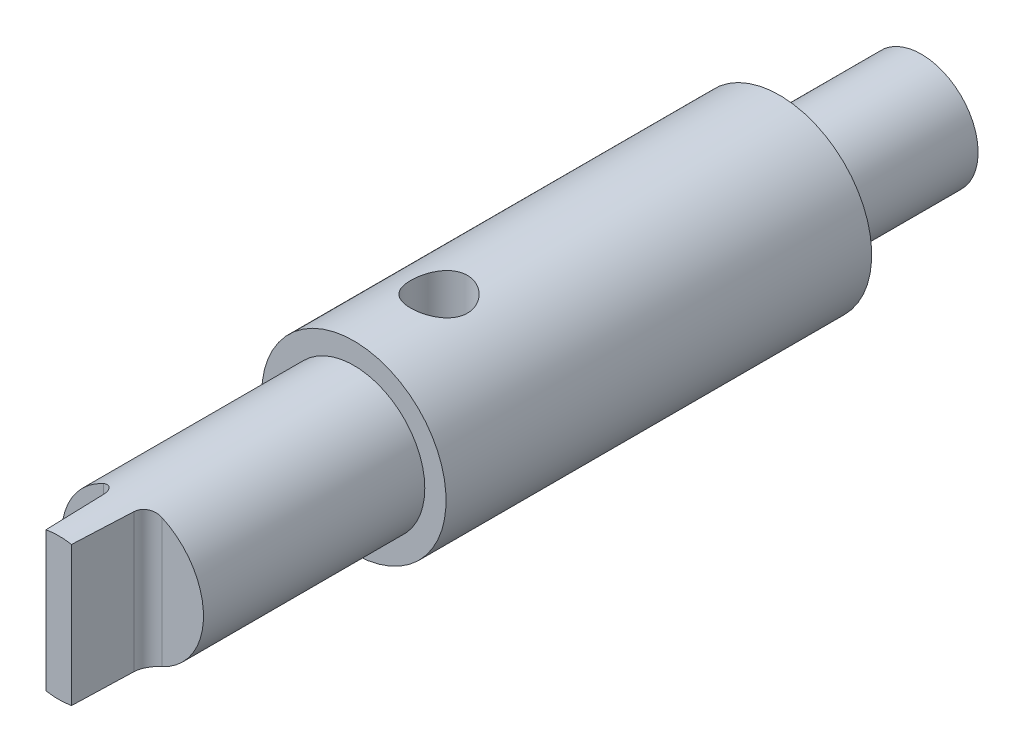
ISO-10303-21;
HEADER;
FILE_DESCRIPTION(('STEP AP214'),'2;1');
FILE_NAME('part.step','',(''),(''),'','','');
FILE_SCHEMA(('AUTOMOTIVE_DESIGN { 1 0 10303 214 1 1 1 1 }'));
ENDSEC;
DATA;
#1=APPLICATION_CONTEXT('core data for automotive mechanical design processes');
#2=APPLICATION_PROTOCOL_DEFINITION('international standard','automotive_design',2000,#1);
#3=PRODUCT_CONTEXT('',#1,'mechanical');
#4=PRODUCT('Part','Part','',(#3));
#5=PRODUCT_RELATED_PRODUCT_CATEGORY('part','',(#4));
#6=PRODUCT_DEFINITION_FORMATION('','',#4);
#7=PRODUCT_DEFINITION_CONTEXT('part definition',#1,'design');
#8=PRODUCT_DEFINITION('design','',#6,#7);
#9=PRODUCT_DEFINITION_SHAPE('','',#8);
#10=(LENGTH_UNIT() NAMED_UNIT(*) SI_UNIT(.MILLI.,.METRE.));
#11=(NAMED_UNIT(*) PLANE_ANGLE_UNIT() SI_UNIT($,.RADIAN.));
#12=(NAMED_UNIT(*) SI_UNIT($,.STERADIAN.) SOLID_ANGLE_UNIT());
#13=UNCERTAINTY_MEASURE_WITH_UNIT(LENGTH_MEASURE(1.E-05),#10,'distance_accuracy_value','');
#14=(GEOMETRIC_REPRESENTATION_CONTEXT(3) GLOBAL_UNCERTAINTY_ASSIGNED_CONTEXT((#13)) GLOBAL_UNIT_ASSIGNED_CONTEXT((#10,
#11,#12)) REPRESENTATION_CONTEXT('',''));
#15=CARTESIAN_POINT('',(0.,0.,0.));
#16=DIRECTION('',(0.,0.,1.));
#17=DIRECTION('',(1.,0.,0.));
#18=AXIS2_PLACEMENT_3D('',#15,#16,#17);
#19=CARTESIAN_POINT('',(0.,0.,10.4));
#20=DIRECTION('',(0.,0.,-1.));
#21=DIRECTION('',(-1.,0.,0.));
#22=AXIS2_PLACEMENT_3D('',#19,#20,#21);
#23=CYLINDRICAL_SURFACE('',#22,2.5);
#24=CARTESIAN_POINT('',(0.,0.,22.1));
#25=DIRECTION('',(0.999261174631314,0.,-0.0384331221012044));
#26=DIRECTION('',(-0.0384331221012044,0.,-0.999261174631314));
#27=AXIS2_PLACEMENT_3D('',#24,#25,#26);
#28=ELLIPSE('',#27,65.0480591562884,2.5);
#29=CARTESIAN_POINT('',(-0.45,-2.45916652547159,10.4));
#30=VERTEX_POINT('',#29);
#31=CARTESIAN_POINT('',(-0.531508329271177,-2.44284647407801,8.2807834389494));
#32=VERTEX_POINT('',#31);
#33=EDGE_CURVE('E105',#30,#32,#28,.T.);
#34=ORIENTED_EDGE('',*,*,#33,.T.);
#35=CARTESIAN_POINT('',(-0.531508329271177,-2.44284647407801,8.2807834389494));
#36=CARTESIAN_POINT('',(-0.532539843165584,-2.44260926882038,8.25327220437519));
#37=CARTESIAN_POINT('',(-0.535894512817613,-2.44189130170681,8.22586203774053));
#38=CARTESIAN_POINT('',(-0.547020238870603,-2.43942979065863,8.17202915411969));
#39=CARTESIAN_POINT('',(-0.554786745288273,-2.43768730326003,8.14560544965633));
#40=CARTESIAN_POINT('',(-0.574513856189634,-2.43311141426534,8.09445915749167));
#41=CARTESIAN_POINT('',(-0.586476409106,-2.43027750580827,8.06973736646394));
#42=CARTESIAN_POINT('',(-0.614184994030151,-2.42342337207427,8.02270265908097));
#43=CARTESIAN_POINT('',(-0.629930425711825,-2.41940333500764,8.00038936132197));
#44=CARTESIAN_POINT('',(-0.664730256340502,-2.41007424679488,7.95870197334573));
#45=CARTESIAN_POINT('',(-0.683794875284227,-2.40476119365302,7.93933731793193));
#46=CARTESIAN_POINT('',(-0.724552410200631,-2.3927963019297,7.90410809790614));
#47=CARTESIAN_POINT('',(-0.746245478837553,-2.38614438557024,7.88824373674754));
#48=CARTESIAN_POINT('',(-0.791993083845285,-2.37135730303825,7.86006199419344));
#49=CARTESIAN_POINT('',(-0.816085761722725,-2.36319546640232,7.84782075439814));
#50=CARTESIAN_POINT('',(-0.86550826826321,-2.34554550328077,7.82747397216907));
#51=CARTESIAN_POINT('',(-0.890838550326685,-2.33605688831899,7.81936995805999));
#52=CARTESIAN_POINT('',(-0.935453508420285,-2.31847922129885,7.80885060287264));
#53=CARTESIAN_POINT('',(-0.954631059674712,-2.31065110483783,7.80551124040373));
#54=CARTESIAN_POINT('',(-0.992956459855976,-2.2944442070253,7.80108746415022));
#55=CARTESIAN_POINT('',(-1.01210425925181,-2.28606688570284,7.79999730327699));
#56=CARTESIAN_POINT('',(-1.03113891658685,-2.27744429892379,7.79999999999995));
#57=B_SPLINE_CURVE_WITH_KNOTS('',3,(#35,#36,#37,#38,#39,#40,#41,#42,#43,#44,#45,#46,#47,#48,#49,
#50,#51,#52,#53,#54,#55,#56),.UNSPECIFIED.,.F.,.F.,(4,2,2,2,2,2,2,2,2,2,4),(0.,
0.0824834719637597,0.164882031712949,0.247318903966105,0.329742702483984,0.41242492872574,
0.495111959577522,0.57943009095499,0.663779347635486,0.726599278197953,0.789258493466607),.UNSPECIFIED.);
#58=CARTESIAN_POINT('',(-1.03113891658683,-2.27744429892371,7.8));
#59=VERTEX_POINT('',#58);
#60=EDGE_CURVE('E192',#32,#59,#57,.T.);
#61=ORIENTED_EDGE('',*,*,#60,.T.);
#62=CARTESIAN_POINT('',(0.,0.,7.8));
#63=DIRECTION('',(0.,0.,-1.));
#64=DIRECTION('',(-1.,0.,0.));
#65=AXIS2_PLACEMENT_3D('',#62,#63,#64);
#66=CIRCLE('',#65,2.5);
#67=CARTESIAN_POINT('',(-1.03113891658683,2.27744429892371,7.8));
#68=VERTEX_POINT('',#67);
#69=EDGE_CURVE('E133',#59,#68,#66,.T.);
#70=ORIENTED_EDGE('',*,*,#69,.T.);
#71=CARTESIAN_POINT('',(-1.03113891658683,2.27744429892371,7.8));
#72=CARTESIAN_POINT('',(-1.00310852586349,2.29015995289099,7.79997451048635));
#73=CARTESIAN_POINT('',(-0.974792224266202,2.3023326194819,7.80235783656512));
#74=CARTESIAN_POINT('',(-0.918401756660368,2.32538997516038,7.81204050674508));
#75=CARTESIAN_POINT('',(-0.890328336994645,2.33627149545594,7.81935166299504));
#76=CARTESIAN_POINT('',(-0.83530343928771,2.3565096654203,7.83901706973389));
#77=CARTESIAN_POINT('',(-0.808355350055991,2.36586192633451,7.85138549018253));
#78=CARTESIAN_POINT('',(-0.756727398889239,2.38287643300169,7.88097572855262));
#79=CARTESIAN_POINT('',(-0.732044130611637,2.39054124185363,7.89819009397633));
#80=CARTESIAN_POINT('',(-0.687333716391683,2.4037645903716,7.93585757854198));
#81=CARTESIAN_POINT('',(-0.667113670057396,2.40942360872693,7.95604671191024));
#82=CARTESIAN_POINT('',(-0.630268879479854,2.41932348767586,7.99979864461768));
#83=CARTESIAN_POINT('',(-0.613645568859418,2.4235637831473,8.02336278300339));
#84=CARTESIAN_POINT('',(-0.585220098070873,2.43058098198555,8.07213677168955));
#85=CARTESIAN_POINT('',(-0.573250637971295,2.43340997514698,8.09724202410013));
#86=CARTESIAN_POINT('',(-0.55362857799055,2.43794951083323,8.14916296550121));
#87=CARTESIAN_POINT('',(-0.545970619262264,2.43966144219827,8.1759764848813));
#88=CARTESIAN_POINT('',(-0.538068699423958,2.44141107555664,8.21602097906955));
#89=CARTESIAN_POINT('',(-0.536046997419788,2.44185512624989,8.22890711252894));
#90=CARTESIAN_POINT('',(-0.53301807569344,2.44251790164472,8.25478117422703));
#91=CARTESIAN_POINT('',(-0.532009104621233,2.44273701535247,8.26776888745287));
#92=CARTESIAN_POINT('',(-0.531508329271177,2.44284647407801,8.2807834389494));
#93=B_SPLINE_CURVE_WITH_KNOTS('',3,(#71,#72,#73,#74,#75,#76,#77,#78,#79,#80,#81,#82,#83,#84,#85,
#86,#87,#88,#89,#90,#91,#92),.UNSPECIFIED.,.F.,.F.,(4,2,2,2,2,2,2,2,2,2,4),(0.,
0.0922959626537357,0.184813951871417,0.277592963439273,0.37023006397065,0.45717528684934,
0.544155101639957,0.62762949695487,0.710999910003441,0.750118521259756,0.78916936621114),.UNSPECIFIED.);
#94=CARTESIAN_POINT('',(-0.531508329271177,2.44284647407801,8.2807834389494));
#95=VERTEX_POINT('',#94);
#96=EDGE_CURVE('E57',#68,#95,#93,.T.);
#97=ORIENTED_EDGE('',*,*,#96,.T.);
#98=CARTESIAN_POINT('',(-0.45,2.45916652547159,10.4));
#99=VERTEX_POINT('',#98);
#100=EDGE_CURVE('E225',#95,#99,#28,.T.);
#101=ORIENTED_EDGE('',*,*,#100,.T.);
#102=CARTESIAN_POINT('',(0.,0.,10.4));
#103=DIRECTION('',(0.,0.,1.));
#104=DIRECTION('',(1.,0.,0.));
#105=AXIS2_PLACEMENT_3D('',#102,#103,#104);
#106=CIRCLE('',#105,2.5);
#107=CARTESIAN_POINT('',(0.45,2.45916652547159,10.4));
#108=VERTEX_POINT('',#107);
#109=EDGE_CURVE('E116',#108,#99,#106,.T.);
#110=ORIENTED_EDGE('',*,*,#109,.F.);
#111=CARTESIAN_POINT('',(0.,0.,22.1));
#112=DIRECTION('',(-0.999261174631314,0.,-0.0384331221012044));
#113=DIRECTION('',(0.0384331221012044,0.,-0.999261174631314));
#114=AXIS2_PLACEMENT_3D('',#111,#112,#113);
#115=ELLIPSE('',#114,65.0480591562884,2.5);
#116=CARTESIAN_POINT('',(0.531508329271177,2.44284647407801,8.2807834389494));
#117=VERTEX_POINT('',#116);
#118=EDGE_CURVE('E106',#108,#117,#115,.T.);
#119=ORIENTED_EDGE('',*,*,#118,.T.);
#120=CARTESIAN_POINT('',(0.531508329271177,2.44284647407801,8.2807834389494));
#121=CARTESIAN_POINT('',(0.532539843165584,2.44260926882038,8.25327220437519));
#122=CARTESIAN_POINT('',(0.535894512817613,2.44189130170681,8.22586203774053));
#123=CARTESIAN_POINT('',(0.547020238870602,2.43942979065863,8.17202915411969));
#124=CARTESIAN_POINT('',(0.554786745288273,2.43768730326003,8.14560544965633));
#125=CARTESIAN_POINT('',(0.574513856189634,2.43311141426534,8.09445915749167));
#126=CARTESIAN_POINT('',(0.586476409106,2.43027750580827,8.06973736646394));
#127=CARTESIAN_POINT('',(0.614184994030151,2.42342337207427,8.02270265908096));
#128=CARTESIAN_POINT('',(0.629930425711825,2.41940333500764,8.00038936132197));
#129=CARTESIAN_POINT('',(0.664730256340502,2.41007424679488,7.95870197334573));
#130=CARTESIAN_POINT('',(0.683794875284228,2.40476119365302,7.93933731793193));
#131=CARTESIAN_POINT('',(0.724552410200632,2.3927963019297,7.90410809790614));
#132=CARTESIAN_POINT('',(0.746245478837555,2.38614438557024,7.88824373674753));
#133=CARTESIAN_POINT('',(0.791993083845286,2.37135730303825,7.86006199419344));
#134=CARTESIAN_POINT('',(0.816085761722726,2.36319546640232,7.84782075439814));
#135=CARTESIAN_POINT('',(0.865508268263211,2.34554550328077,7.82747397216907));
#136=CARTESIAN_POINT('',(0.890838550326685,2.33605688831899,7.81936995805999));
#137=CARTESIAN_POINT('',(0.935453508420286,2.31847922129885,7.80885060287264));
#138=CARTESIAN_POINT('',(0.954631059674712,2.31065110483783,7.80551124040373));
#139=CARTESIAN_POINT('',(0.992956459855976,2.2944442070253,7.80108746415022));
#140=CARTESIAN_POINT('',(1.01210425925181,2.28606688570284,7.79999730327699));
#141=CARTESIAN_POINT('',(1.03113891658685,2.27744429892379,7.79999999999995));
#142=B_SPLINE_CURVE_WITH_KNOTS('',3,(#120,#121,#122,#123,#124,#125,#126,#127,#128,#129,#130,
#131,#132,#133,#134,#135,#136,#137,#138,#139,#140,#141),.UNSPECIFIED.,.F.,.F.,(4,2,2,2,2,2,2,2,
2,2,4),(0.,0.0824834719637597,0.164882031712949,0.247318903966107,0.329742702483984,
0.412424928725741,0.495111959577524,0.579430090954991,0.663779347635487,0.726599278197954,
0.789258493466607),.UNSPECIFIED.);
#143=CARTESIAN_POINT('',(1.03113891658683,2.27744429892371,7.8));
#144=VERTEX_POINT('',#143);
#145=EDGE_CURVE('E143',#117,#144,#142,.T.);
#146=ORIENTED_EDGE('',*,*,#145,.T.);
#147=CARTESIAN_POINT('',(0.,0.,7.8));
#148=DIRECTION('',(0.,0.,-1.));
#149=DIRECTION('',(-1.,0.,0.));
#150=AXIS2_PLACEMENT_3D('',#147,#148,#149);
#151=CIRCLE('',#150,2.5);
#152=CARTESIAN_POINT('',(1.03113891658683,-2.27744429892371,7.8));
#153=VERTEX_POINT('',#152);
#154=EDGE_CURVE('E131',#144,#153,#151,.T.);
#155=ORIENTED_EDGE('',*,*,#154,.T.);
#156=CARTESIAN_POINT('',(1.03113891658683,-2.27744429892371,7.8));
#157=CARTESIAN_POINT('',(1.00310852586349,-2.29015995289099,7.79997451048635));
#158=CARTESIAN_POINT('',(0.974792224266202,-2.3023326194819,7.80235783656512));
#159=CARTESIAN_POINT('',(0.918401756660368,-2.32538997516038,7.81204050674508));
#160=CARTESIAN_POINT('',(0.890328336994645,-2.33627149545594,7.81935166299504));
#161=CARTESIAN_POINT('',(0.83530343928771,-2.3565096654203,7.83901706973389));
#162=CARTESIAN_POINT('',(0.808355350055991,-2.36586192633451,7.85138549018253));
#163=CARTESIAN_POINT('',(0.756727398889239,-2.38287643300169,7.88097572855262));
#164=CARTESIAN_POINT('',(0.732044130611637,-2.39054124185363,7.89819009397633));
#165=CARTESIAN_POINT('',(0.687333716391683,-2.4037645903716,7.93585757854198));
#166=CARTESIAN_POINT('',(0.667113670057396,-2.40942360872693,7.95604671191024));
#167=CARTESIAN_POINT('',(0.630268879479854,-2.41932348767586,7.99979864461768));
#168=CARTESIAN_POINT('',(0.613645568859418,-2.4235637831473,8.02336278300339));
#169=CARTESIAN_POINT('',(0.585220098070873,-2.43058098198555,8.07213677168955));
#170=CARTESIAN_POINT('',(0.573250637971294,-2.43340997514698,8.09724202410013));
#171=CARTESIAN_POINT('',(0.55362857799055,-2.43794951083323,8.14916296550121));
#172=CARTESIAN_POINT('',(0.545970619262263,-2.43966144219827,8.1759764848813));
#173=CARTESIAN_POINT('',(0.538068699423957,-2.44141107555664,8.21602097906955));
#174=CARTESIAN_POINT('',(0.536046997419788,-2.44185512624989,8.22890711252894));
#175=CARTESIAN_POINT('',(0.53301807569344,-2.44251790164472,8.25478117422703));
#176=CARTESIAN_POINT('',(0.532009104621232,-2.44273701535247,8.26776888745287));
#177=CARTESIAN_POINT('',(0.531508329271177,-2.44284647407801,8.2807834389494));
#178=B_SPLINE_CURVE_WITH_KNOTS('',3,(#156,#157,#158,#159,#160,#161,#162,#163,#164,#165,#166,
#167,#168,#169,#170,#171,#172,#173,#174,#175,#176,#177),.UNSPECIFIED.,.F.,.F.,(4,2,2,2,2,2,2,2,
2,2,4),(0.,0.0922959626537352,0.184813951871416,0.277592963439273,0.37023006397065,
0.45717528684934,0.544155101639958,0.62762949695487,0.710999910003441,0.750118521259756,
0.78916936621114),.UNSPECIFIED.);
#179=CARTESIAN_POINT('',(0.531508329271177,-2.44284647407801,8.2807834389494));
#180=VERTEX_POINT('',#179);
#181=EDGE_CURVE('E101',#153,#180,#178,.T.);
#182=ORIENTED_EDGE('',*,*,#181,.T.);
#183=CARTESIAN_POINT('',(0.45,-2.45916652547159,10.4));
#184=VERTEX_POINT('',#183);
#185=EDGE_CURVE('E94',#180,#184,#115,.T.);
#186=ORIENTED_EDGE('',*,*,#185,.T.);
#187=EDGE_CURVE('E98',#30,#184,#106,.T.);
#188=ORIENTED_EDGE('',*,*,#187,.F.);
#189=EDGE_LOOP('',(#34,#61,#70,#97,#101,#110,#119,#146,#155,#182,#186,#188));
#190=FACE_BOUND('',#189,.T.);
#191=CARTESIAN_POINT('',(0.,0.,0.));
#192=DIRECTION('',(0.,0.,1.));
#193=DIRECTION('',(1.,0.,0.));
#194=AXIS2_PLACEMENT_3D('',#191,#192,#193);
#195=CIRCLE('',#194,2.5);
#196=CARTESIAN_POINT('',(2.5,0.,0.));
#197=VERTEX_POINT('',#196);
#198=EDGE_CURVE('E121',#197,#197,#195,.T.);
#199=ORIENTED_EDGE('',*,*,#198,.T.);
#200=EDGE_LOOP('',(#199));
#201=FACE_BOUND('',#200,.T.);
#202=ADVANCED_FACE('F35',(#190,#201),#23,.T.);
#203=CARTESIAN_POINT('',(0.,0.,10.4));
#204=DIRECTION('',(0.,0.,1.));
#205=DIRECTION('',(1.,0.,0.));
#206=AXIS2_PLACEMENT_3D('',#203,#204,#205);
#207=PLANE('',#206);
#208=DIRECTION('',(0.,1.,0.));
#209=VECTOR('',#208,1.);
#210=CARTESIAN_POINT('',(-0.45,0.,10.4));
#211=LINE('',#210,#209);
#212=EDGE_CURVE('E115',#30,#99,#211,.T.);
#213=ORIENTED_EDGE('',*,*,#212,.F.);
#214=ORIENTED_EDGE('',*,*,#187,.T.);
#215=DIRECTION('',(0.,-1.,0.));
#216=VECTOR('',#215,1.);
#217=CARTESIAN_POINT('',(0.45,0.,10.4));
#218=LINE('',#217,#216);
#219=EDGE_CURVE('E109',#108,#184,#218,.T.);
#220=ORIENTED_EDGE('',*,*,#219,.F.);
#221=ORIENTED_EDGE('',*,*,#109,.T.);
#222=EDGE_LOOP('',(#213,#214,#220,#221));
#223=FACE_BOUND('',#222,.T.);
#224=ADVANCED_FACE('F119',(#223),#207,.T.);
#225=CARTESIAN_POINT('',(0.,0.,-15.));
#226=DIRECTION('',(0.,0.,1.));
#227=DIRECTION('',(1.,0.,0.));
#228=AXIS2_PLACEMENT_3D('',#225,#226,#227);
#229=CYLINDRICAL_SURFACE('',#228,3.25);
#230=CARTESIAN_POINT('',(0.,-3.25,-2.));
#231=CARTESIAN_POINT('',(0.05479323577704,-3.24999964593717,-2.00000048046048));
#232=CARTESIAN_POINT('',(0.109591380674737,-3.24860117896465,-2.00451832380163));
#233=CARTESIAN_POINT('',(0.217587764492186,-3.24315927632536,-2.02242470596761));
#234=CARTESIAN_POINT('',(0.27078559315014,-3.23911516835768,-2.03581549956625));
#235=CARTESIAN_POINT('',(0.37400827349235,-3.22882429243838,-2.07097535344639));
#236=CARTESIAN_POINT('',(0.424037813545171,-3.22258087330619,-2.09273168038839));
#237=CARTESIAN_POINT('',(0.519738727683587,-3.2085376795897,-2.14395160368362));
#238=CARTESIAN_POINT('',(0.565409454596777,-3.20073767442191,-2.17341634211691));
#239=CARTESIAN_POINT('',(0.652468496238395,-3.18414876203309,-2.24014883771997));
#240=CARTESIAN_POINT('',(0.693707442829189,-3.17533880293744,-2.27760620962156));
#241=CARTESIAN_POINT('',(0.769428541349361,-3.15784626407671,-2.35885681175398));
#242=CARTESIAN_POINT('',(0.803909483312973,-3.14916370737896,-2.40265117413597));
#243=CARTESIAN_POINT('',(0.865936380924626,-3.1326843892283,-2.49661430221368));
#244=CARTESIAN_POINT('',(0.893297406809984,-3.12491368022042,-2.54691014464889));
#245=CARTESIAN_POINT('',(0.939111220907898,-3.11145374193487,-2.65166698186863));
#246=CARTESIAN_POINT('',(0.957566274573321,-3.10576398340558,-2.70612691332719));
#247=CARTESIAN_POINT('',(0.984500802565942,-3.09733004500646,-2.81598365302622));
#248=CARTESIAN_POINT('',(0.99325669777995,-3.09450445018857,-2.87130626680365));
#249=CARTESIAN_POINT('',(1.00140777947709,-3.09187685250425,-2.9827018702862));
#250=CARTESIAN_POINT('',(1.0008053678641,-3.0920740738014,-3.03877466375875));
#251=CARTESIAN_POINT('',(0.990473491141605,-3.09539784681446,-3.14780753529945));
#252=CARTESIAN_POINT('',(0.981093423514268,-3.09841225365569,-3.20080471266111));
#253=CARTESIAN_POINT('',(0.95403822625464,-3.10684886127525,-3.30443334829845));
#254=CARTESIAN_POINT('',(0.936362239574196,-3.11227131082442,-3.35506456155292));
#255=CARTESIAN_POINT('',(0.892966108504002,-3.12500035360975,-3.45336502392251));
#256=CARTESIAN_POINT('',(0.867134854135757,-3.1323327108677,-3.50098174281422));
#257=CARTESIAN_POINT('',(0.808238629241269,-3.14804336788111,-3.59132027218585));
#258=CARTESIAN_POINT('',(0.775171828178709,-3.15642193208797,-3.63404083980296));
#259=CARTESIAN_POINT('',(0.701020570657276,-3.17373275991764,-3.71535219416603));
#260=CARTESIAN_POINT('',(0.659647081479265,-3.18267315556576,-3.75367814128331));
#261=CARTESIAN_POINT('',(0.570948854412362,-3.19977415266621,-3.82291110217156));
#262=CARTESIAN_POINT('',(0.523623702453827,-3.20793469979325,-3.85381759932025));
#263=CARTESIAN_POINT('',(0.42386646184878,-3.22263778433887,-3.90750648856375));
#264=CARTESIAN_POINT('',(0.371399359483455,-3.22916797499509,-3.93022743201941));
#265=CARTESIAN_POINT('',(0.263140467454892,-3.23978551159736,-3.96644312697926));
#266=CARTESIAN_POINT('',(0.207349660507884,-3.24387357570092,-3.97994059100533));
#267=CARTESIAN_POINT('',(0.0962764162161222,-3.24903145035923,-3.99687902328754));
#268=CARTESIAN_POINT('',(0.0410535933640621,-3.25020886057154,-4.00067867628285));
#269=CARTESIAN_POINT('',(-0.0692455890038648,-3.24973000158302,-3.999122616756));
#270=CARTESIAN_POINT('',(-0.124321968094146,-3.24807413236151,-3.99376819653147));
#271=CARTESIAN_POINT('',(-0.231392900725741,-3.24218537424115,-3.97434475894488));
#272=CARTESIAN_POINT('',(-0.283429679390035,-3.23801519887068,-3.9604876764169));
#273=CARTESIAN_POINT('',(-0.384426405684671,-3.22758363268153,-3.92470946178647));
#274=CARTESIAN_POINT('',(-0.433385976126802,-3.22132198609282,-3.90278734336204));
#275=CARTESIAN_POINT('',(-0.528139807223371,-3.20716691455592,-3.85091440259494));
#276=CARTESIAN_POINT('',(-0.573830407597931,-3.19923805637076,-3.82078416161711));
#277=CARTESIAN_POINT('',(-0.659628034161941,-3.18265666811097,-3.75356658495989));
#278=CARTESIAN_POINT('',(-0.699733585370003,-3.17400394783041,-3.71647741751313));
#279=CARTESIAN_POINT('',(-0.774817640045949,-3.1565332295644,-3.63470835027433));
#280=CARTESIAN_POINT('',(-0.809540655042264,-3.14772161176481,-3.58979196202085));
#281=CARTESIAN_POINT('',(-0.870977438863422,-3.13127981652477,-3.49457833270358));
#282=CARTESIAN_POINT('',(-0.897691369472254,-3.12364961522114,-3.44428120035899));
#283=CARTESIAN_POINT('',(-0.942178538830938,-3.11052063437294,-3.33986087152405));
#284=CARTESIAN_POINT('',(-0.959989335533069,-3.10501292401928,-3.28575486506206));
#285=CARTESIAN_POINT('',(-0.986187630630237,-3.09679288022364,-3.17510869208082));
#286=CARTESIAN_POINT('',(-0.994578574365014,-3.09407952476793,-3.11856942339611));
#287=CARTESIAN_POINT('',(-1.00145661894791,-3.09185966185363,-3.00732596396564));
#288=CARTESIAN_POINT('',(-1.00036180360619,-3.09221777259158,-2.95264999775053));
#289=CARTESIAN_POINT('',(-0.989304282813584,-3.09577292563913,-2.84430108059371));
#290=CARTESIAN_POINT('',(-0.979341967713307,-3.09896984298339,-2.79062808560701));
#291=CARTESIAN_POINT('',(-0.951108289335903,-3.10774925285108,-2.68653128572379));
#292=CARTESIAN_POINT('',(-0.932953082491063,-3.11329833252062,-2.63607294715558));
#293=CARTESIAN_POINT('',(-0.888940006239355,-3.12614920507149,-2.53887822168925));
#294=CARTESIAN_POINT('',(-0.863080605033256,-3.13345134645211,-2.49214257730616));
#295=CARTESIAN_POINT('',(-0.803240864379769,-3.14933258215382,-2.40179374625918));
#296=CARTESIAN_POINT('',(-0.768988760086614,-3.15794971620251,-2.35836725293357));
#297=CARTESIAN_POINT('',(-0.693818358789412,-3.17531131834717,-2.27774296651042));
#298=CARTESIAN_POINT('',(-0.652898300001127,-3.18405581953809,-2.24054682485678));
#299=CARTESIAN_POINT('',(-0.564011585387617,-3.20101521207057,-2.17227541020154));
#300=CARTESIAN_POINT('',(-0.51586443284265,-3.20920495318988,-2.14142821233257));
#301=CARTESIAN_POINT('',(-0.414815596004902,-3.22382191529294,-2.08830777167376));
#302=CARTESIAN_POINT('',(-0.361915932016202,-3.23024988054853,-2.06603090668949));
#303=CARTESIAN_POINT('',(-0.257964826285709,-3.240126741732,-2.0324496439699));
#304=CARTESIAN_POINT('',(-0.207201629257763,-3.24379767402724,-2.02031526445543));
#305=CARTESIAN_POINT('',(-0.104293595914259,-3.24873424545537,-2.00409097033839));
#306=CARTESIAN_POINT('',(-0.0521490213291673,-3.25000033697645,-1.9999995427256));
#307=CARTESIAN_POINT('',(0.,-3.25,-2.));
#308=B_SPLINE_CURVE_WITH_KNOTS('',3,(#230,#231,#232,#233,#234,#235,#236,#237,#238,#239,#240,
#241,#242,#243,#244,#245,#246,#247,#248,#249,#250,#251,#252,#253,#254,#255,#256,#257,#258,#259,
#260,#261,#262,#263,#264,#265,#266,#267,#268,#269,#270,#271,#272,#273,#274,#275,#276,#277,#278,
#279,#280,#281,#282,#283,#284,#285,#286,#287,#288,#289,#290,#291,#292,#293,#294,#295,#296,#297,
#298,#299,#300,#301,#302,#303,#304,#305,#306,#307),.UNSPECIFIED.,.T.,.F.,(4,2,2,2,2,2,2,2,2,2,2,
2,2,2,2,2,2,2,2,2,2,2,2,2,2,2,2,2,2,2,2,2,2,2,2,2,2,2,4),(0.,0.164188074176602,
0.328417887460232,0.492398706659821,0.656403835068971,0.824848009810257,0.993322315615957,
1.16581309987692,1.33825998370974,1.5056545637311,1.67300618095446,1.83396742975997,
1.99494531107073,2.15821862294085,2.32153328952976,2.49204253997148,2.66256365966813,
2.83433943781323,3.00606467686201,3.17133983324618,3.33659165935418,3.49788296100021,
3.65919399449491,3.82436162674905,3.98957279649661,4.1611174390105,4.3326586160787,
4.50346990581857,4.67421870043689,4.83748137854003,5.00073687011514,5.16174715132054,
5.32278946705122,5.48996474235128,5.65718425996785,5.82963876285307,6.00202029870236,
6.15831438165326,6.31457906032768),.UNSPECIFIED.);
#309=CARTESIAN_POINT('',(0.,-3.25,-2.));
#310=VERTEX_POINT('',#309);
#311=EDGE_CURVE('E40',#310,#310,#308,.T.);
#312=ORIENTED_EDGE('',*,*,#311,.T.);
#313=EDGE_LOOP('',(#312));
#314=FACE_BOUND('',#313,.T.);
#315=CARTESIAN_POINT('',(0.,3.25,-2.));
#316=CARTESIAN_POINT('',(-0.05479323577704,3.24999964593717,-2.00000048046048));
#317=CARTESIAN_POINT('',(-0.109591380674737,3.24860117896465,-2.00451832380163));
#318=CARTESIAN_POINT('',(-0.217587764492186,3.24315927632536,-2.02242470596761));
#319=CARTESIAN_POINT('',(-0.27078559315014,3.23911516835768,-2.03581549956625));
#320=CARTESIAN_POINT('',(-0.37400827349235,3.22882429243838,-2.07097535344639));
#321=CARTESIAN_POINT('',(-0.424037813545171,3.22258087330619,-2.09273168038839));
#322=CARTESIAN_POINT('',(-0.519738727683587,3.2085376795897,-2.14395160368362));
#323=CARTESIAN_POINT('',(-0.565409454596777,3.20073767442191,-2.17341634211691));
#324=CARTESIAN_POINT('',(-0.652468496238395,3.18414876203309,-2.24014883771997));
#325=CARTESIAN_POINT('',(-0.693707442829189,3.17533880293744,-2.27760620962156));
#326=CARTESIAN_POINT('',(-0.769428541349361,3.15784626407671,-2.35885681175398));
#327=CARTESIAN_POINT('',(-0.803909483312973,3.14916370737896,-2.40265117413597));
#328=CARTESIAN_POINT('',(-0.865936380924626,3.1326843892283,-2.49661430221368));
#329=CARTESIAN_POINT('',(-0.893297406809984,3.12491368022042,-2.54691014464889));
#330=CARTESIAN_POINT('',(-0.939111220907898,3.11145374193487,-2.65166698186863));
#331=CARTESIAN_POINT('',(-0.957566274573321,3.10576398340558,-2.70612691332719));
#332=CARTESIAN_POINT('',(-0.984500802565942,3.09733004500646,-2.81598365302622));
#333=CARTESIAN_POINT('',(-0.99325669777995,3.09450445018857,-2.87130626680365));
#334=CARTESIAN_POINT('',(-1.00140777947709,3.09187685250425,-2.9827018702862));
#335=CARTESIAN_POINT('',(-1.0008053678641,3.0920740738014,-3.03877466375875));
#336=CARTESIAN_POINT('',(-0.990473491141605,3.09539784681446,-3.14780753529945));
#337=CARTESIAN_POINT('',(-0.981093423514268,3.09841225365569,-3.20080471266111));
#338=CARTESIAN_POINT('',(-0.95403822625464,3.10684886127525,-3.30443334829845));
#339=CARTESIAN_POINT('',(-0.936362239574196,3.11227131082442,-3.35506456155292));
#340=CARTESIAN_POINT('',(-0.892966108504002,3.12500035360975,-3.45336502392251));
#341=CARTESIAN_POINT('',(-0.867134854135757,3.1323327108677,-3.50098174281422));
#342=CARTESIAN_POINT('',(-0.808238629241269,3.14804336788111,-3.59132027218585));
#343=CARTESIAN_POINT('',(-0.775171828178709,3.15642193208797,-3.63404083980296));
#344=CARTESIAN_POINT('',(-0.701020570657276,3.17373275991764,-3.71535219416603));
#345=CARTESIAN_POINT('',(-0.659647081479265,3.18267315556576,-3.75367814128331));
#346=CARTESIAN_POINT('',(-0.570948854412362,3.19977415266621,-3.82291110217156));
#347=CARTESIAN_POINT('',(-0.523623702453827,3.20793469979325,-3.85381759932025));
#348=CARTESIAN_POINT('',(-0.42386646184878,3.22263778433887,-3.90750648856375));
#349=CARTESIAN_POINT('',(-0.371399359483455,3.22916797499509,-3.93022743201941));
#350=CARTESIAN_POINT('',(-0.263140467454892,3.23978551159736,-3.96644312697926));
#351=CARTESIAN_POINT('',(-0.207349660507884,3.24387357570092,-3.97994059100533));
#352=CARTESIAN_POINT('',(-0.0962764162161222,3.24903145035923,-3.99687902328754));
#353=CARTESIAN_POINT('',(-0.0410535933640621,3.25020886057154,-4.00067867628285));
#354=CARTESIAN_POINT('',(0.0692455890038648,3.24973000158302,-3.999122616756));
#355=CARTESIAN_POINT('',(0.124321968094146,3.24807413236151,-3.99376819653147));
#356=CARTESIAN_POINT('',(0.231392900725741,3.24218537424115,-3.97434475894488));
#357=CARTESIAN_POINT('',(0.283429679390035,3.23801519887068,-3.9604876764169));
#358=CARTESIAN_POINT('',(0.384426405684671,3.22758363268153,-3.92470946178647));
#359=CARTESIAN_POINT('',(0.433385976126802,3.22132198609282,-3.90278734336204));
#360=CARTESIAN_POINT('',(0.528139807223371,3.20716691455592,-3.85091440259494));
#361=CARTESIAN_POINT('',(0.573830407597931,3.19923805637076,-3.82078416161711));
#362=CARTESIAN_POINT('',(0.659628034161941,3.18265666811097,-3.75356658495989));
#363=CARTESIAN_POINT('',(0.699733585370003,3.17400394783041,-3.71647741751313));
#364=CARTESIAN_POINT('',(0.774817640045949,3.1565332295644,-3.63470835027433));
#365=CARTESIAN_POINT('',(0.809540655042264,3.14772161176481,-3.58979196202085));
#366=CARTESIAN_POINT('',(0.870977438863422,3.13127981652477,-3.49457833270358));
#367=CARTESIAN_POINT('',(0.897691369472254,3.12364961522114,-3.44428120035899));
#368=CARTESIAN_POINT('',(0.942178538830938,3.11052063437294,-3.33986087152405));
#369=CARTESIAN_POINT('',(0.959989335533069,3.10501292401928,-3.28575486506206));
#370=CARTESIAN_POINT('',(0.986187630630237,3.09679288022364,-3.17510869208082));
#371=CARTESIAN_POINT('',(0.994578574365014,3.09407952476793,-3.11856942339611));
#372=CARTESIAN_POINT('',(1.00145661894791,3.09185966185363,-3.00732596396564));
#373=CARTESIAN_POINT('',(1.00036180360619,3.09221777259158,-2.95264999775053));
#374=CARTESIAN_POINT('',(0.989304282813584,3.09577292563913,-2.84430108059371));
#375=CARTESIAN_POINT('',(0.979341967713307,3.09896984298339,-2.79062808560701));
#376=CARTESIAN_POINT('',(0.951108289335903,3.10774925285108,-2.68653128572379));
#377=CARTESIAN_POINT('',(0.932953082491063,3.11329833252062,-2.63607294715558));
#378=CARTESIAN_POINT('',(0.888940006239355,3.12614920507149,-2.53887822168925));
#379=CARTESIAN_POINT('',(0.863080605033256,3.13345134645211,-2.49214257730616));
#380=CARTESIAN_POINT('',(0.803240864379769,3.14933258215382,-2.40179374625918));
#381=CARTESIAN_POINT('',(0.768988760086614,3.15794971620251,-2.35836725293357));
#382=CARTESIAN_POINT('',(0.693818358789412,3.17531131834717,-2.27774296651042));
#383=CARTESIAN_POINT('',(0.652898300001127,3.18405581953809,-2.24054682485678));
#384=CARTESIAN_POINT('',(0.564011585387617,3.20101521207057,-2.17227541020154));
#385=CARTESIAN_POINT('',(0.51586443284265,3.20920495318988,-2.14142821233257));
#386=CARTESIAN_POINT('',(0.414815596004902,3.22382191529294,-2.08830777167376));
#387=CARTESIAN_POINT('',(0.361915932016202,3.23024988054853,-2.06603090668949));
#388=CARTESIAN_POINT('',(0.257964826285709,3.240126741732,-2.0324496439699));
#389=CARTESIAN_POINT('',(0.207201629257763,3.24379767402724,-2.02031526445543));
#390=CARTESIAN_POINT('',(0.104293595914259,3.24873424545537,-2.00409097033839));
#391=CARTESIAN_POINT('',(0.0521490213291673,3.25000033697645,-1.9999995427256));
#392=CARTESIAN_POINT('',(0.,3.25,-2.));
#393=B_SPLINE_CURVE_WITH_KNOTS('',3,(#315,#316,#317,#318,#319,#320,#321,#322,#323,#324,#325,
#326,#327,#328,#329,#330,#331,#332,#333,#334,#335,#336,#337,#338,#339,#340,#341,#342,#343,#344,
#345,#346,#347,#348,#349,#350,#351,#352,#353,#354,#355,#356,#357,#358,#359,#360,#361,#362,#363,
#364,#365,#366,#367,#368,#369,#370,#371,#372,#373,#374,#375,#376,#377,#378,#379,#380,#381,#382,
#383,#384,#385,#386,#387,#388,#389,#390,#391,#392),.UNSPECIFIED.,.T.,.F.,(4,2,2,2,2,2,2,2,2,2,2,
2,2,2,2,2,2,2,2,2,2,2,2,2,2,2,2,2,2,2,2,2,2,2,2,2,2,2,4),(0.,0.164188074176602,
0.328417887460232,0.492398706659821,0.656403835068971,0.824848009810257,0.993322315615957,
1.16581309987692,1.33825998370974,1.5056545637311,1.67300618095446,1.83396742975997,
1.99494531107073,2.15821862294085,2.32153328952976,2.49204253997148,2.66256365966813,
2.83433943781323,3.00606467686201,3.17133983324618,3.33659165935418,3.49788296100021,
3.65919399449491,3.82436162674905,3.98957279649661,4.1611174390105,4.3326586160787,
4.50346990581857,4.67421870043689,4.83748137854003,5.00073687011514,5.16174715132054,
5.32278946705122,5.48996474235128,5.65718425996785,5.82963876285307,6.00202029870236,
6.15831438165326,6.31457906032768),.UNSPECIFIED.);
#394=CARTESIAN_POINT('',(0.,3.25,-2.));
#395=VERTEX_POINT('',#394);
#396=EDGE_CURVE('E186',#395,#395,#393,.T.);
#397=ORIENTED_EDGE('',*,*,#396,.T.);
#398=EDGE_LOOP('',(#397));
#399=FACE_BOUND('',#398,.T.);
#400=CARTESIAN_POINT('',(0.,0.,-15.));
#401=DIRECTION('',(0.,0.,-1.));
#402=DIRECTION('',(-1.,0.,0.));
#403=AXIS2_PLACEMENT_3D('',#400,#401,#402);
#404=CIRCLE('',#403,3.25);
#405=CARTESIAN_POINT('',(-3.25,0.,-15.));
#406=VERTEX_POINT('',#405);
#407=EDGE_CURVE('E124',#406,#406,#404,.T.);
#408=ORIENTED_EDGE('',*,*,#407,.F.);
#409=EDGE_LOOP('',(#408));
#410=FACE_BOUND('',#409,.T.);
#411=CARTESIAN_POINT('',(0.,0.,0.));
#412=DIRECTION('',(0.,0.,-1.));
#413=DIRECTION('',(-1.,0.,0.));
#414=AXIS2_PLACEMENT_3D('',#411,#412,#413);
#415=CIRCLE('',#414,3.25);
#416=CARTESIAN_POINT('',(-3.25,0.,0.));
#417=VERTEX_POINT('',#416);
#418=EDGE_CURVE('E127',#417,#417,#415,.T.);
#419=ORIENTED_EDGE('',*,*,#418,.T.);
#420=EDGE_LOOP('',(#419));
#421=FACE_BOUND('',#420,.T.);
#422=ADVANCED_FACE('F175',(#314,#399,#410,#421),#229,.T.);
#423=CARTESIAN_POINT('',(0.,0.,-15.));
#424=DIRECTION('',(0.,0.,-1.));
#425=DIRECTION('',(-1.,0.,0.));
#426=AXIS2_PLACEMENT_3D('',#423,#424,#425);
#427=PLANE('',#426);
#428=CARTESIAN_POINT('',(0.,0.,-15.));
#429=DIRECTION('',(0.,0.,-1.));
#430=DIRECTION('',(-1.,0.,0.));
#431=AXIS2_PLACEMENT_3D('',#428,#429,#430);
#432=CIRCLE('',#431,2.);
#433=CARTESIAN_POINT('',(-2.,0.,-15.));
#434=VERTEX_POINT('',#433);
#435=EDGE_CURVE('E11',#434,#434,#432,.T.);
#436=ORIENTED_EDGE('',*,*,#435,.F.);
#437=EDGE_LOOP('',(#436));
#438=FACE_BOUND('',#437,.T.);
#439=ORIENTED_EDGE('',*,*,#407,.T.);
#440=EDGE_LOOP('',(#439));
#441=FACE_BOUND('',#440,.T.);
#442=ADVANCED_FACE('F179',(#438,#441),#427,.T.);
#443=CARTESIAN_POINT('',(0.,0.,0.));
#444=DIRECTION('',(0.,0.,-1.));
#445=DIRECTION('',(-1.,0.,0.));
#446=AXIS2_PLACEMENT_3D('',#443,#444,#445);
#447=PLANE('',#446);
#448=ORIENTED_EDGE('',*,*,#198,.F.);
#449=EDGE_LOOP('',(#448));
#450=FACE_BOUND('',#449,.T.);
#451=ORIENTED_EDGE('',*,*,#418,.F.);
#452=EDGE_LOOP('',(#451));
#453=FACE_BOUND('',#452,.T.);
#454=ADVANCED_FACE('F183',(#450,#453),#447,.F.);
#455=CARTESIAN_POINT('',(0.55,-3.25,7.8));
#456=DIRECTION('',(0.,0.,-1.));
#457=DIRECTION('',(-1.,0.,0.));
#458=AXIS2_PLACEMENT_3D('',#455,#456,#457);
#459=PLANE('',#458);
#460=ORIENTED_EDGE('',*,*,#154,.F.);
#461=DIRECTION('',(0.,1.,0.));
#462=VECTOR('',#461,1.);
#463=CARTESIAN_POINT('',(1.03113891658683,-2.43874967965144,7.8));
#464=LINE('',#463,#462);
#465=EDGE_CURVE('E137',#144,#153,#464,.F.);
#466=ORIENTED_EDGE('',*,*,#465,.T.);
#467=EDGE_LOOP('',(#460,#466));
#468=FACE_BOUND('',#467,.T.);
#469=ADVANCED_FACE('F210',(#468),#459,.F.);
#470=CARTESIAN_POINT('',(0.45,-3.25,10.4));
#471=DIRECTION('',(-0.999261174631314,0.,-0.0384331221012044));
#472=DIRECTION('',(-0.0384331221012044,0.,0.999261174631314));
#473=AXIS2_PLACEMENT_3D('',#470,#471,#472);
#474=PLANE('',#473);
#475=ORIENTED_EDGE('',*,*,#185,.F.);
#476=DIRECTION('',(0.,1.,0.));
#477=VECTOR('',#476,1.);
#478=CARTESIAN_POINT('',(0.531508329271177,2.43874967965144,8.2807834389494));
#479=LINE('',#478,#477);
#480=EDGE_CURVE('E135',#180,#117,#479,.T.);
#481=ORIENTED_EDGE('',*,*,#480,.T.);
#482=ORIENTED_EDGE('',*,*,#118,.F.);
#483=ORIENTED_EDGE('',*,*,#219,.T.);
#484=EDGE_LOOP('',(#475,#481,#482,#483));
#485=FACE_BOUND('',#484,.T.);
#486=ADVANCED_FACE('F110',(#485),#474,.F.);
#487=CARTESIAN_POINT('',(-0.55,-3.25,7.8));
#488=DIRECTION('',(0.,0.,-1.));
#489=DIRECTION('',(-1.,0.,0.));
#490=AXIS2_PLACEMENT_3D('',#487,#488,#489);
#491=PLANE('',#490);
#492=ORIENTED_EDGE('',*,*,#69,.F.);
#493=DIRECTION('',(0.,1.,0.));
#494=VECTOR('',#493,1.);
#495=CARTESIAN_POINT('',(-1.03113891658683,2.43874967965144,7.8));
#496=LINE('',#495,#494);
#497=EDGE_CURVE('E139',#59,#68,#496,.T.);
#498=ORIENTED_EDGE('',*,*,#497,.T.);
#499=EDGE_LOOP('',(#492,#498));
#500=FACE_BOUND('',#499,.T.);
#501=ADVANCED_FACE('F169',(#500),#491,.F.);
#502=CARTESIAN_POINT('',(-0.45,-3.25,10.4));
#503=DIRECTION('',(0.999261174631314,0.,-0.0384331221012044));
#504=DIRECTION('',(-0.0384331221012044,0.,-0.999261174631314));
#505=AXIS2_PLACEMENT_3D('',#502,#503,#504);
#506=PLANE('',#505);
#507=ORIENTED_EDGE('',*,*,#100,.F.);
#508=DIRECTION('',(0.,1.,0.));
#509=VECTOR('',#508,1.);
#510=CARTESIAN_POINT('',(-0.531508329271177,-2.43874967965144,8.2807834389494));
#511=LINE('',#510,#509);
#512=EDGE_CURVE('E64',#95,#32,#511,.F.);
#513=ORIENTED_EDGE('',*,*,#512,.T.);
#514=ORIENTED_EDGE('',*,*,#33,.F.);
#515=ORIENTED_EDGE('',*,*,#212,.T.);
#516=EDGE_LOOP('',(#507,#513,#514,#515));
#517=FACE_BOUND('',#516,.T.);
#518=ADVANCED_FACE('F160',(#517),#506,.F.);
#519=CARTESIAN_POINT('',(1.03113891658683,-3.25,8.3));
#520=DIRECTION('',(0.,-1.,0.));
#521=DIRECTION('',(0.,0.,-1.));
#522=AXIS2_PLACEMENT_3D('',#519,#520,#521);
#523=CYLINDRICAL_SURFACE('',#522,0.5);
#524=ORIENTED_EDGE('',*,*,#181,.F.);
#525=ORIENTED_EDGE('',*,*,#465,.F.);
#526=ORIENTED_EDGE('',*,*,#145,.F.);
#527=ORIENTED_EDGE('',*,*,#480,.F.);
#528=EDGE_LOOP('',(#524,#525,#526,#527));
#529=FACE_BOUND('',#528,.T.);
#530=ADVANCED_FACE('F157',(#529),#523,.F.);
#531=CARTESIAN_POINT('',(-1.03113891658683,-3.25,8.3));
#532=DIRECTION('',(0.,-1.,0.));
#533=DIRECTION('',(0.,0.,-1.));
#534=AXIS2_PLACEMENT_3D('',#531,#532,#533);
#535=CYLINDRICAL_SURFACE('',#534,0.5);
#536=ORIENTED_EDGE('',*,*,#60,.F.);
#537=ORIENTED_EDGE('',*,*,#512,.F.);
#538=ORIENTED_EDGE('',*,*,#96,.F.);
#539=ORIENTED_EDGE('',*,*,#497,.F.);
#540=EDGE_LOOP('',(#536,#537,#538,#539));
#541=FACE_BOUND('',#540,.T.);
#542=ADVANCED_FACE('F37',(#541),#535,.F.);
#543=CARTESIAN_POINT('',(0.,-3.25,-3.));
#544=DIRECTION('',(0.,1.,0.));
#545=DIRECTION('',(0.,0.,1.));
#546=AXIS2_PLACEMENT_3D('',#543,#544,#545);
#547=CYLINDRICAL_SURFACE('',#546,1.);
#548=ORIENTED_EDGE('',*,*,#396,.F.);
#549=EDGE_LOOP('',(#548));
#550=FACE_BOUND('',#549,.T.);
#551=ORIENTED_EDGE('',*,*,#311,.F.);
#552=EDGE_LOOP('',(#551));
#553=FACE_BOUND('',#552,.T.);
#554=ADVANCED_FACE('F167',(#550,#553),#547,.F.);
#555=CARTESIAN_POINT('',(0.,0.,-20.));
#556=DIRECTION('',(0.,0.,1.));
#557=DIRECTION('',(1.,0.,0.));
#558=AXIS2_PLACEMENT_3D('',#555,#556,#557);
#559=CYLINDRICAL_SURFACE('',#558,2.);
#560=CARTESIAN_POINT('',(0.,0.,-20.));
#561=DIRECTION('',(0.,0.,-1.));
#562=DIRECTION('',(-1.,0.,0.));
#563=AXIS2_PLACEMENT_3D('',#560,#561,#562);
#564=CIRCLE('',#563,2.);
#565=CARTESIAN_POINT('',(-2.,0.,-20.));
#566=VERTEX_POINT('',#565);
#567=EDGE_CURVE('E227',#566,#566,#564,.T.);
#568=ORIENTED_EDGE('',*,*,#567,.F.);
#569=EDGE_LOOP('',(#568));
#570=FACE_BOUND('',#569,.T.);
#571=ORIENTED_EDGE('',*,*,#435,.T.);
#572=EDGE_LOOP('',(#571));
#573=FACE_BOUND('',#572,.T.);
#574=ADVANCED_FACE('F201',(#570,#573),#559,.T.);
#575=CARTESIAN_POINT('',(0.,0.,-20.));
#576=DIRECTION('',(0.,0.,-1.));
#577=DIRECTION('',(-1.,0.,0.));
#578=AXIS2_PLACEMENT_3D('',#575,#576,#577);
#579=PLANE('',#578);
#580=ORIENTED_EDGE('',*,*,#567,.T.);
#581=EDGE_LOOP('',(#580));
#582=FACE_BOUND('',#581,.T.);
#583=ADVANCED_FACE('F232',(#582),#579,.T.);
#584=CLOSED_SHELL('',(#202,#224,#422,#442,#454,#469,#486,#501,#518,#530,#542,#554,#574,#583));
#585=MANIFOLD_SOLID_BREP('B2',#584);
#586=ADVANCED_BREP_SHAPE_REPRESENTATION('',(#18,#585),#14);
#587=SHAPE_DEFINITION_REPRESENTATION(#9,#586);
ENDSEC;
END-ISO-10303-21;
